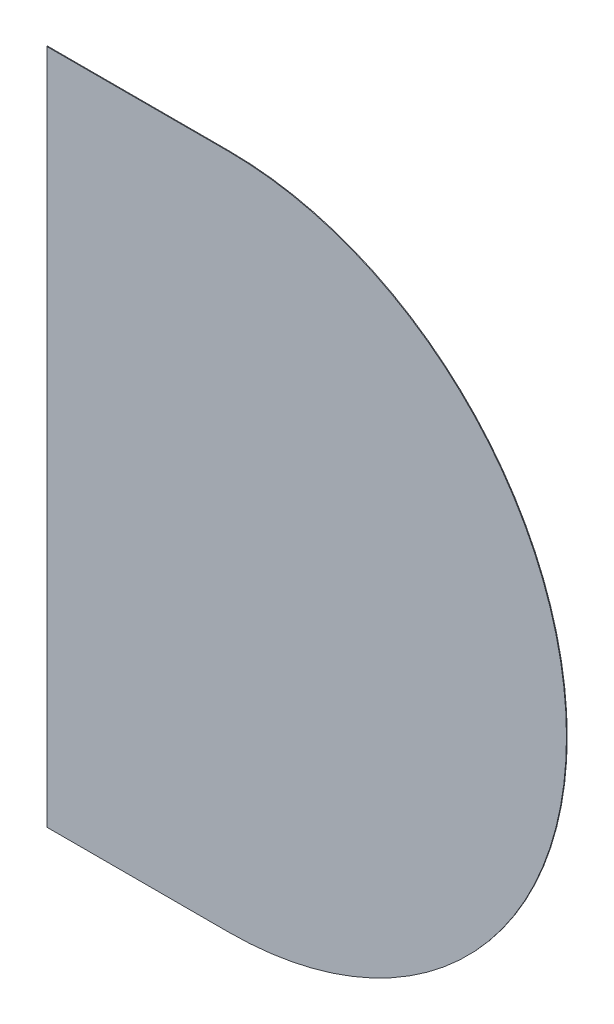
ISO-10303-21;
HEADER;
FILE_DESCRIPTION(('STEP AP214'),'2;1');
FILE_NAME('part.step','',(''),(''),'','','');
FILE_SCHEMA(('AUTOMOTIVE_DESIGN { 1 0 10303 214 1 1 1 1 }'));
ENDSEC;
DATA;
#1=APPLICATION_CONTEXT('core data for automotive mechanical design processes');
#2=APPLICATION_PROTOCOL_DEFINITION('international standard','automotive_design',2000,#1);
#3=PRODUCT_CONTEXT('',#1,'mechanical');
#4=PRODUCT('Part','Part','',(#3));
#5=PRODUCT_RELATED_PRODUCT_CATEGORY('part','',(#4));
#6=PRODUCT_DEFINITION_FORMATION('','',#4);
#7=PRODUCT_DEFINITION_CONTEXT('part definition',#1,'design');
#8=PRODUCT_DEFINITION('design','',#6,#7);
#9=PRODUCT_DEFINITION_SHAPE('','',#8);
#10=(LENGTH_UNIT() NAMED_UNIT(*) SI_UNIT(.MILLI.,.METRE.));
#11=(NAMED_UNIT(*) PLANE_ANGLE_UNIT() SI_UNIT($,.RADIAN.));
#12=(NAMED_UNIT(*) SI_UNIT($,.STERADIAN.) SOLID_ANGLE_UNIT());
#13=UNCERTAINTY_MEASURE_WITH_UNIT(LENGTH_MEASURE(1.E-05),#10,'distance_accuracy_value','');
#14=(GEOMETRIC_REPRESENTATION_CONTEXT(3) GLOBAL_UNCERTAINTY_ASSIGNED_CONTEXT((#13)) GLOBAL_UNIT_ASSIGNED_CONTEXT((#10,
#11,#12)) REPRESENTATION_CONTEXT('',''));
#15=CARTESIAN_POINT('',(0.,0.,0.));
#16=DIRECTION('',(0.,0.,1.));
#17=DIRECTION('',(1.,0.,0.));
#18=AXIS2_PLACEMENT_3D('',#15,#16,#17);
#19=CARTESIAN_POINT('',(0.,0.,2.));
#20=DIRECTION('',(1.,0.,0.));
#21=DIRECTION('',(0.,1.,0.));
#22=AXIS2_PLACEMENT_3D('',#19,#20,#21);
#23=PLANE('',#22);
#24=DIRECTION('',(0.,-1.,0.));
#25=VECTOR('',#24,1.);
#26=CARTESIAN_POINT('',(0.,0.,0.));
#27=LINE('',#26,#25);
#28=CARTESIAN_POINT('',(-3.31573120869146E-13,1805.,0.));
#29=VERTEX_POINT('',#28);
#30=CARTESIAN_POINT('',(0.,0.,0.));
#31=VERTEX_POINT('',#30);
#32=EDGE_CURVE('E96',#29,#31,#27,.T.);
#33=ORIENTED_EDGE('',*,*,#32,.T.);
#34=DIRECTION('',(0.,0.,-1.));
#35=VECTOR('',#34,1.);
#36=CARTESIAN_POINT('',(0.,0.,2.));
#37=LINE('',#36,#35);
#38=CARTESIAN_POINT('',(0.,0.,2.));
#39=VERTEX_POINT('',#38);
#40=EDGE_CURVE('E11',#39,#31,#37,.T.);
#41=ORIENTED_EDGE('',*,*,#40,.F.);
#42=DIRECTION('',(0.,-1.,0.));
#43=VECTOR('',#42,1.);
#44=CARTESIAN_POINT('',(0.,0.,2.));
#45=LINE('',#44,#43);
#46=CARTESIAN_POINT('',(-3.31573120869146E-13,1805.,2.));
#47=VERTEX_POINT('',#46);
#48=EDGE_CURVE('E84',#47,#39,#45,.T.);
#49=ORIENTED_EDGE('',*,*,#48,.F.);
#50=DIRECTION('',(0.,0.,-1.));
#51=VECTOR('',#50,1.);
#52=CARTESIAN_POINT('',(-3.31573120869146E-13,1805.,2.));
#53=LINE('',#52,#51);
#54=EDGE_CURVE('E92',#47,#29,#53,.T.);
#55=ORIENTED_EDGE('',*,*,#54,.T.);
#56=EDGE_LOOP('',(#33,#41,#49,#55));
#57=FACE_BOUND('',#56,.T.);
#58=ADVANCED_FACE('F33',(#57),#23,.F.);
#59=CARTESIAN_POINT('',(0.,0.,2.));
#60=DIRECTION('',(0.,1.,0.));
#61=DIRECTION('',(0.,0.,1.));
#62=AXIS2_PLACEMENT_3D('',#59,#60,#61);
#63=PLANE('',#62);
#64=DIRECTION('',(1.,0.,0.));
#65=VECTOR('',#64,1.);
#66=CARTESIAN_POINT('',(0.,0.,0.));
#67=LINE('',#66,#65);
#68=CARTESIAN_POINT('',(485.,0.,0.));
#69=VERTEX_POINT('',#68);
#70=EDGE_CURVE('E88',#31,#69,#67,.T.);
#71=ORIENTED_EDGE('',*,*,#70,.T.);
#72=DIRECTION('',(0.,0.,-1.));
#73=VECTOR('',#72,1.);
#74=CARTESIAN_POINT('',(485.,0.,2.));
#75=LINE('',#74,#73);
#76=CARTESIAN_POINT('',(485.,0.,2.));
#77=VERTEX_POINT('',#76);
#78=EDGE_CURVE('E41',#77,#69,#75,.T.);
#79=ORIENTED_EDGE('',*,*,#78,.F.);
#80=DIRECTION('',(1.,0.,0.));
#81=VECTOR('',#80,1.);
#82=CARTESIAN_POINT('',(0.,0.,2.));
#83=LINE('',#82,#81);
#84=EDGE_CURVE('E79',#39,#77,#83,.T.);
#85=ORIENTED_EDGE('',*,*,#84,.F.);
#86=ORIENTED_EDGE('',*,*,#40,.T.);
#87=EDGE_LOOP('',(#71,#79,#85,#86));
#88=FACE_BOUND('',#87,.T.);
#89=ADVANCED_FACE('F87',(#88),#63,.F.);
#90=CARTESIAN_POINT('',(485.,902.5,2.));
#91=DIRECTION('',(0.,0.,-1.));
#92=DIRECTION('',(-1.,0.,0.));
#93=AXIS2_PLACEMENT_3D('',#90,#91,#92);
#94=CYLINDRICAL_SURFACE('',#93,902.5);
#95=CARTESIAN_POINT('',(485.,902.5,0.));
#96=DIRECTION('',(0.,0.,1.));
#97=DIRECTION('',(-1.,0.,0.));
#98=AXIS2_PLACEMENT_3D('',#95,#96,#97);
#99=CIRCLE('',#98,902.5);
#100=CARTESIAN_POINT('',(485.,1805.,0.));
#101=VERTEX_POINT('',#100);
#102=EDGE_CURVE('E66',#69,#101,#99,.T.);
#103=ORIENTED_EDGE('',*,*,#102,.T.);
#104=DIRECTION('',(0.,0.,-1.));
#105=VECTOR('',#104,1.);
#106=CARTESIAN_POINT('',(485.,1805.,2.));
#107=LINE('',#106,#105);
#108=CARTESIAN_POINT('',(485.,1805.,2.));
#109=VERTEX_POINT('',#108);
#110=EDGE_CURVE('E89',#109,#101,#107,.T.);
#111=ORIENTED_EDGE('',*,*,#110,.F.);
#112=CARTESIAN_POINT('',(485.,902.5,2.));
#113=DIRECTION('',(0.,0.,1.));
#114=DIRECTION('',(-1.,0.,0.));
#115=AXIS2_PLACEMENT_3D('',#112,#113,#114);
#116=CIRCLE('',#115,902.5);
#117=EDGE_CURVE('E82',#77,#109,#116,.T.);
#118=ORIENTED_EDGE('',*,*,#117,.F.);
#119=ORIENTED_EDGE('',*,*,#78,.T.);
#120=EDGE_LOOP('',(#103,#111,#118,#119));
#121=FACE_BOUND('',#120,.T.);
#122=ADVANCED_FACE('F90',(#121),#94,.T.);
#123=CARTESIAN_POINT('',(-3.31573120869146E-13,1805.,2.));
#124=DIRECTION('',(0.,-1.,0.));
#125=DIRECTION('',(1.,0.,0.));
#126=AXIS2_PLACEMENT_3D('',#123,#124,#125);
#127=PLANE('',#126);
#128=DIRECTION('',(-1.,0.,0.));
#129=VECTOR('',#128,1.);
#130=CARTESIAN_POINT('',(-3.31573120869146E-13,1805.,0.));
#131=LINE('',#130,#129);
#132=EDGE_CURVE('E72',#101,#29,#131,.T.);
#133=ORIENTED_EDGE('',*,*,#132,.T.);
#134=ORIENTED_EDGE('',*,*,#54,.F.);
#135=DIRECTION('',(-1.,0.,0.));
#136=VECTOR('',#135,1.);
#137=CARTESIAN_POINT('',(-3.31573120869146E-13,1805.,2.));
#138=LINE('',#137,#136);
#139=EDGE_CURVE('E49',#109,#47,#138,.T.);
#140=ORIENTED_EDGE('',*,*,#139,.F.);
#141=ORIENTED_EDGE('',*,*,#110,.T.);
#142=EDGE_LOOP('',(#133,#134,#140,#141));
#143=FACE_BOUND('',#142,.T.);
#144=ADVANCED_FACE('F103',(#143),#127,.F.);
#145=CARTESIAN_POINT('',(485.,902.5,2.));
#146=DIRECTION('',(0.,0.,-1.));
#147=DIRECTION('',(-1.,0.,0.));
#148=AXIS2_PLACEMENT_3D('',#145,#146,#147);
#149=PLANE('',#148);
#150=ORIENTED_EDGE('',*,*,#48,.T.);
#151=ORIENTED_EDGE('',*,*,#84,.T.);
#152=ORIENTED_EDGE('',*,*,#117,.T.);
#153=ORIENTED_EDGE('',*,*,#139,.T.);
#154=EDGE_LOOP('',(#150,#151,#152,#153));
#155=FACE_BOUND('',#154,.T.);
#156=ADVANCED_FACE('F80',(#155),#149,.F.);
#157=CARTESIAN_POINT('',(485.,902.5,0.));
#158=DIRECTION('',(0.,0.,-1.));
#159=DIRECTION('',(-1.,0.,0.));
#160=AXIS2_PLACEMENT_3D('',#157,#158,#159);
#161=PLANE('',#160);
#162=ORIENTED_EDGE('',*,*,#32,.F.);
#163=ORIENTED_EDGE('',*,*,#132,.F.);
#164=ORIENTED_EDGE('',*,*,#102,.F.);
#165=ORIENTED_EDGE('',*,*,#70,.F.);
#166=EDGE_LOOP('',(#162,#163,#164,#165));
#167=FACE_BOUND('',#166,.T.);
#168=ADVANCED_FACE('F106',(#167),#161,.T.);
#169=CLOSED_SHELL('',(#58,#89,#122,#144,#156,#168));
#170=MANIFOLD_SOLID_BREP('B2',#169);
#171=ADVANCED_BREP_SHAPE_REPRESENTATION('',(#18,#170),#14);
#172=SHAPE_DEFINITION_REPRESENTATION(#9,#171);
ENDSEC;
END-ISO-10303-21;
